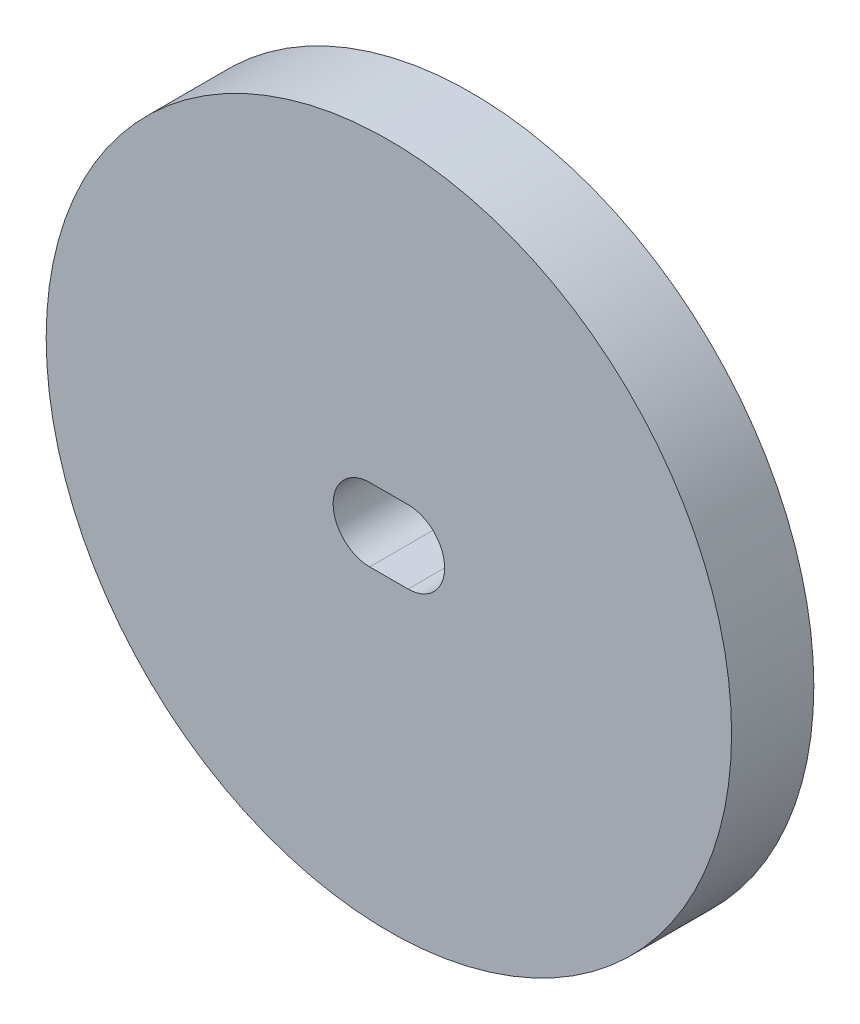
ISO-10303-21;
HEADER;
FILE_DESCRIPTION(('STEP AP214'),'2;1');
FILE_NAME('part.step','',(''),(''),'','','');
FILE_SCHEMA(('AUTOMOTIVE_DESIGN { 1 0 10303 214 1 1 1 1 }'));
ENDSEC;
DATA;
#1=APPLICATION_CONTEXT('core data for automotive mechanical design processes');
#2=APPLICATION_PROTOCOL_DEFINITION('international standard','automotive_design',2000,#1);
#3=PRODUCT_CONTEXT('',#1,'mechanical');
#4=PRODUCT('Part','Part','',(#3));
#5=PRODUCT_RELATED_PRODUCT_CATEGORY('part','',(#4));
#6=PRODUCT_DEFINITION_FORMATION('','',#4);
#7=PRODUCT_DEFINITION_CONTEXT('part definition',#1,'design');
#8=PRODUCT_DEFINITION('design','',#6,#7);
#9=PRODUCT_DEFINITION_SHAPE('','',#8);
#10=(LENGTH_UNIT() NAMED_UNIT(*) SI_UNIT(.MILLI.,.METRE.));
#11=(NAMED_UNIT(*) PLANE_ANGLE_UNIT() SI_UNIT($,.RADIAN.));
#12=(NAMED_UNIT(*) SI_UNIT($,.STERADIAN.) SOLID_ANGLE_UNIT());
#13=UNCERTAINTY_MEASURE_WITH_UNIT(LENGTH_MEASURE(1.E-05),#10,'distance_accuracy_value','');
#14=(GEOMETRIC_REPRESENTATION_CONTEXT(3) GLOBAL_UNCERTAINTY_ASSIGNED_CONTEXT((#13)) GLOBAL_UNIT_ASSIGNED_CONTEXT((#10,
#11,#12)) REPRESENTATION_CONTEXT('',''));
#15=CARTESIAN_POINT('',(0.,0.,0.));
#16=DIRECTION('',(0.,0.,1.));
#17=DIRECTION('',(1.,0.,0.));
#18=AXIS2_PLACEMENT_3D('',#15,#16,#17);
#19=CARTESIAN_POINT('',(0.,0.,4.5));
#20=DIRECTION('',(0.,0.,1.));
#21=DIRECTION('',(1.,0.,0.));
#22=AXIS2_PLACEMENT_3D('',#19,#20,#21);
#23=PLANE('',#22);
#24=CARTESIAN_POINT('',(0.,0.,4.5));
#25=DIRECTION('',(0.,0.,1.));
#26=DIRECTION('',(1.,0.,0.));
#27=AXIS2_PLACEMENT_3D('',#24,#25,#26);
#28=CIRCLE('',#27,18.75);
#29=CARTESIAN_POINT('',(18.75,0.,4.5));
#30=VERTEX_POINT('',#29);
#31=EDGE_CURVE('E11',#30,#30,#28,.T.);
#32=ORIENTED_EDGE('',*,*,#31,.T.);
#33=EDGE_LOOP('',(#32));
#34=FACE_BOUND('',#33,.T.);
#35=DIRECTION('',(1.,0.,0.));
#36=VECTOR('',#35,1.);
#37=CARTESIAN_POINT('',(-1.05,-2.,4.5));
#38=LINE('',#37,#36);
#39=CARTESIAN_POINT('',(-1.05,-2.,4.5));
#40=VERTEX_POINT('',#39);
#41=CARTESIAN_POINT('',(1.05,-2.,4.5));
#42=VERTEX_POINT('',#41);
#43=EDGE_CURVE('E94',#40,#42,#38,.T.);
#44=ORIENTED_EDGE('',*,*,#43,.F.);
#45=CARTESIAN_POINT('',(-1.05,0.,4.5));
#46=DIRECTION('',(0.,0.,1.));
#47=DIRECTION('',(1.,0.,0.));
#48=AXIS2_PLACEMENT_3D('',#45,#46,#47);
#49=CIRCLE('',#48,2.);
#50=CARTESIAN_POINT('',(-1.05,2.,4.5));
#51=VERTEX_POINT('',#50);
#52=EDGE_CURVE('E85',#51,#40,#49,.T.);
#53=ORIENTED_EDGE('',*,*,#52,.F.);
#54=DIRECTION('',(-1.,0.,0.));
#55=VECTOR('',#54,1.);
#56=CARTESIAN_POINT('',(-1.05,2.,4.5));
#57=LINE('',#56,#55);
#58=CARTESIAN_POINT('',(1.05,2.,4.5));
#59=VERTEX_POINT('',#58);
#60=EDGE_CURVE('E110',#59,#51,#57,.T.);
#61=ORIENTED_EDGE('',*,*,#60,.F.);
#62=CARTESIAN_POINT('',(1.05,0.,4.5));
#63=DIRECTION('',(0.,0.,1.));
#64=DIRECTION('',(1.,0.,0.));
#65=AXIS2_PLACEMENT_3D('',#62,#63,#64);
#66=CIRCLE('',#65,2.);
#67=EDGE_CURVE('E106',#42,#59,#66,.T.);
#68=ORIENTED_EDGE('',*,*,#67,.F.);
#69=EDGE_LOOP('',(#44,#53,#61,#68));
#70=FACE_BOUND('',#69,.T.);
#71=ADVANCED_FACE('F43',(#34,#70),#23,.T.);
#72=CARTESIAN_POINT('',(0.,0.,0.));
#73=DIRECTION('',(0.,0.,1.));
#74=DIRECTION('',(1.,0.,0.));
#75=AXIS2_PLACEMENT_3D('',#72,#73,#74);
#76=PLANE('',#75);
#77=CARTESIAN_POINT('',(0.,0.,0.));
#78=DIRECTION('',(0.,0.,1.));
#79=DIRECTION('',(1.,0.,0.));
#80=AXIS2_PLACEMENT_3D('',#77,#78,#79);
#81=CIRCLE('',#80,18.75);
#82=CARTESIAN_POINT('',(18.75,0.,0.));
#83=VERTEX_POINT('',#82);
#84=EDGE_CURVE('E47',#83,#83,#81,.T.);
#85=ORIENTED_EDGE('',*,*,#84,.F.);
#86=EDGE_LOOP('',(#85));
#87=FACE_BOUND('',#86,.T.);
#88=CARTESIAN_POINT('',(-1.05,0.,0.));
#89=DIRECTION('',(0.,0.,1.));
#90=DIRECTION('',(1.,0.,0.));
#91=AXIS2_PLACEMENT_3D('',#88,#89,#90);
#92=CIRCLE('',#91,2.);
#93=CARTESIAN_POINT('',(-1.05,2.,0.));
#94=VERTEX_POINT('',#93);
#95=CARTESIAN_POINT('',(-1.05,-2.,0.));
#96=VERTEX_POINT('',#95);
#97=EDGE_CURVE('E67',#94,#96,#92,.T.);
#98=ORIENTED_EDGE('',*,*,#97,.T.);
#99=DIRECTION('',(1.,0.,0.));
#100=VECTOR('',#99,1.);
#101=CARTESIAN_POINT('',(-1.05,-2.,0.));
#102=LINE('',#101,#100);
#103=CARTESIAN_POINT('',(1.05,-2.,0.));
#104=VERTEX_POINT('',#103);
#105=EDGE_CURVE('E101',#96,#104,#102,.T.);
#106=ORIENTED_EDGE('',*,*,#105,.T.);
#107=CARTESIAN_POINT('',(1.05,0.,0.));
#108=DIRECTION('',(0.,0.,1.));
#109=DIRECTION('',(1.,0.,0.));
#110=AXIS2_PLACEMENT_3D('',#107,#108,#109);
#111=CIRCLE('',#110,2.);
#112=CARTESIAN_POINT('',(1.05,2.,0.));
#113=VERTEX_POINT('',#112);
#114=EDGE_CURVE('E119',#104,#113,#111,.T.);
#115=ORIENTED_EDGE('',*,*,#114,.T.);
#116=DIRECTION('',(-1.,0.,0.));
#117=VECTOR('',#116,1.);
#118=CARTESIAN_POINT('',(-1.05,2.,0.));
#119=LINE('',#118,#117);
#120=EDGE_CURVE('E95',#113,#94,#119,.T.);
#121=ORIENTED_EDGE('',*,*,#120,.T.);
#122=EDGE_LOOP('',(#98,#106,#115,#121));
#123=FACE_BOUND('',#122,.T.);
#124=ADVANCED_FACE('F135',(#87,#123),#76,.F.);
#125=CARTESIAN_POINT('',(0.,0.,4.5));
#126=DIRECTION('',(0.,0.,-1.));
#127=DIRECTION('',(-1.,0.,0.));
#128=AXIS2_PLACEMENT_3D('',#125,#126,#127);
#129=CYLINDRICAL_SURFACE('',#128,18.75);
#130=ORIENTED_EDGE('',*,*,#31,.F.);
#131=EDGE_LOOP('',(#130));
#132=FACE_BOUND('',#131,.T.);
#133=ORIENTED_EDGE('',*,*,#84,.T.);
#134=EDGE_LOOP('',(#133));
#135=FACE_BOUND('',#134,.T.);
#136=ADVANCED_FACE('F45',(#132,#135),#129,.T.);
#137=CARTESIAN_POINT('',(-1.05,0.,4.5));
#138=DIRECTION('',(0.,0.,-1.));
#139=DIRECTION('',(-1.,0.,0.));
#140=AXIS2_PLACEMENT_3D('',#137,#138,#139);
#141=CYLINDRICAL_SURFACE('',#140,2.);
#142=ORIENTED_EDGE('',*,*,#97,.F.);
#143=DIRECTION('',(0.,0.,-1.));
#144=VECTOR('',#143,1.);
#145=CARTESIAN_POINT('',(-1.05,2.,4.5));
#146=LINE('',#145,#144);
#147=EDGE_CURVE('E89',#51,#94,#146,.T.);
#148=ORIENTED_EDGE('',*,*,#147,.F.);
#149=ORIENTED_EDGE('',*,*,#52,.T.);
#150=DIRECTION('',(0.,0.,-1.));
#151=VECTOR('',#150,1.);
#152=CARTESIAN_POINT('',(-1.05,-2.,4.5));
#153=LINE('',#152,#151);
#154=EDGE_CURVE('E88',#40,#96,#153,.T.);
#155=ORIENTED_EDGE('',*,*,#154,.T.);
#156=EDGE_LOOP('',(#142,#148,#149,#155));
#157=FACE_BOUND('',#156,.T.);
#158=ADVANCED_FACE('F87',(#157),#141,.F.);
#159=CARTESIAN_POINT('',(-1.05,-2.,4.5));
#160=DIRECTION('',(0.,1.,0.));
#161=DIRECTION('',(0.,0.,1.));
#162=AXIS2_PLACEMENT_3D('',#159,#160,#161);
#163=PLANE('',#162);
#164=ORIENTED_EDGE('',*,*,#105,.F.);
#165=ORIENTED_EDGE('',*,*,#154,.F.);
#166=ORIENTED_EDGE('',*,*,#43,.T.);
#167=DIRECTION('',(0.,0.,-1.));
#168=VECTOR('',#167,1.);
#169=CARTESIAN_POINT('',(1.05,-2.,4.5));
#170=LINE('',#169,#168);
#171=EDGE_CURVE('E103',#42,#104,#170,.T.);
#172=ORIENTED_EDGE('',*,*,#171,.T.);
#173=EDGE_LOOP('',(#164,#165,#166,#172));
#174=FACE_BOUND('',#173,.T.);
#175=ADVANCED_FACE('F98',(#174),#163,.T.);
#176=CARTESIAN_POINT('',(1.05,0.,4.5));
#177=DIRECTION('',(0.,0.,-1.));
#178=DIRECTION('',(-1.,0.,0.));
#179=AXIS2_PLACEMENT_3D('',#176,#177,#178);
#180=CYLINDRICAL_SURFACE('',#179,2.);
#181=ORIENTED_EDGE('',*,*,#114,.F.);
#182=ORIENTED_EDGE('',*,*,#171,.F.);
#183=ORIENTED_EDGE('',*,*,#67,.T.);
#184=DIRECTION('',(0.,0.,-1.));
#185=VECTOR('',#184,1.);
#186=CARTESIAN_POINT('',(1.05,2.,4.5));
#187=LINE('',#186,#185);
#188=EDGE_CURVE('E59',#59,#113,#187,.T.);
#189=ORIENTED_EDGE('',*,*,#188,.T.);
#190=EDGE_LOOP('',(#181,#182,#183,#189));
#191=FACE_BOUND('',#190,.T.);
#192=ADVANCED_FACE('F133',(#191),#180,.F.);
#193=CARTESIAN_POINT('',(-1.05,2.,4.5));
#194=DIRECTION('',(0.,-1.,0.));
#195=DIRECTION('',(0.,0.,-1.));
#196=AXIS2_PLACEMENT_3D('',#193,#194,#195);
#197=PLANE('',#196);
#198=ORIENTED_EDGE('',*,*,#120,.F.);
#199=ORIENTED_EDGE('',*,*,#188,.F.);
#200=ORIENTED_EDGE('',*,*,#60,.T.);
#201=ORIENTED_EDGE('',*,*,#147,.T.);
#202=EDGE_LOOP('',(#198,#199,#200,#201));
#203=FACE_BOUND('',#202,.T.);
#204=ADVANCED_FACE('F136',(#203),#197,.T.);
#205=CLOSED_SHELL('',(#71,#124,#136,#158,#175,#192,#204));
#206=MANIFOLD_SOLID_BREP('B2',#205);
#207=ADVANCED_BREP_SHAPE_REPRESENTATION('',(#18,#206),#14);
#208=SHAPE_DEFINITION_REPRESENTATION(#9,#207);
ENDSEC;
END-ISO-10303-21;
